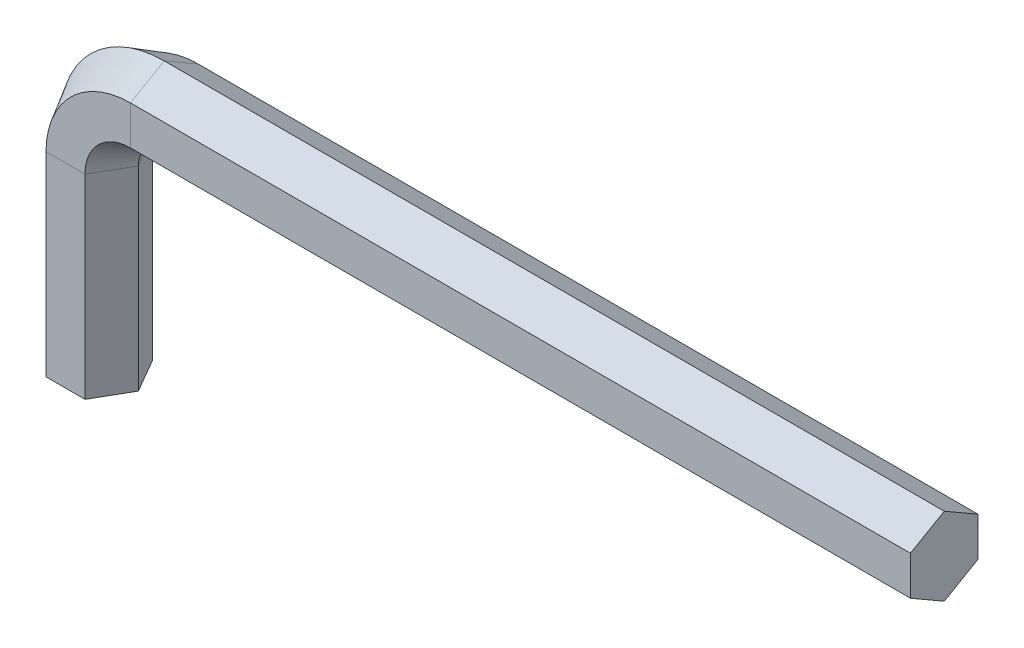
ISO-10303-21;
HEADER;
FILE_DESCRIPTION(('STEP AP214'),'2;1');
FILE_NAME('part.step','',(''),(''),'','','');
FILE_SCHEMA(('AUTOMOTIVE_DESIGN { 1 0 10303 214 1 1 1 1 }'));
ENDSEC;
DATA;
#1=APPLICATION_CONTEXT('core data for automotive mechanical design processes');
#2=APPLICATION_PROTOCOL_DEFINITION('international standard','automotive_design',2000,#1);
#3=PRODUCT_CONTEXT('',#1,'mechanical');
#4=PRODUCT('Part','Part','',(#3));
#5=PRODUCT_RELATED_PRODUCT_CATEGORY('part','',(#4));
#6=PRODUCT_DEFINITION_FORMATION('','',#4);
#7=PRODUCT_DEFINITION_CONTEXT('part definition',#1,'design');
#8=PRODUCT_DEFINITION('design','',#6,#7);
#9=PRODUCT_DEFINITION_SHAPE('','',#8);
#10=(LENGTH_UNIT() NAMED_UNIT(*) SI_UNIT(.MILLI.,.METRE.));
#11=(NAMED_UNIT(*) PLANE_ANGLE_UNIT() SI_UNIT($,.RADIAN.));
#12=(NAMED_UNIT(*) SI_UNIT($,.STERADIAN.) SOLID_ANGLE_UNIT());
#13=UNCERTAINTY_MEASURE_WITH_UNIT(LENGTH_MEASURE(1.E-05),#10,'distance_accuracy_value','');
#14=(GEOMETRIC_REPRESENTATION_CONTEXT(3) GLOBAL_UNCERTAINTY_ASSIGNED_CONTEXT((#13)) GLOBAL_UNIT_ASSIGNED_CONTEXT((#10,
#11,#12)) REPRESENTATION_CONTEXT('',''));
#15=CARTESIAN_POINT('',(0.,0.,0.));
#16=DIRECTION('',(0.,0.,1.));
#17=DIRECTION('',(1.,0.,0.));
#18=AXIS2_PLACEMENT_3D('',#15,#16,#17);
#19=CARTESIAN_POINT('',(0.,0.,0.));
#20=DIRECTION('',(0.,1.,0.));
#21=DIRECTION('',(0.,0.,1.));
#22=AXIS2_PLACEMENT_3D('',#19,#20,#21);
#23=PLANE('',#22);
#24=DIRECTION('',(1.,0.,0.));
#25=VECTOR('',#24,1.);
#26=CARTESIAN_POINT('',(-1.5,0.,2.59807621135332));
#27=LINE('',#26,#25);
#28=CARTESIAN_POINT('',(-1.5,0.,2.59807621135332));
#29=VERTEX_POINT('',#28);
#30=CARTESIAN_POINT('',(1.5,0.,2.59807621135332));
#31=VERTEX_POINT('',#30);
#32=EDGE_CURVE('E189',#29,#31,#27,.T.);
#33=ORIENTED_EDGE('',*,*,#32,.F.);
#34=DIRECTION('',(0.5,0.,0.866025403784439));
#35=VECTOR('',#34,1.);
#36=CARTESIAN_POINT('',(-3.,0.,0.));
#37=LINE('',#36,#35);
#38=CARTESIAN_POINT('',(-3.,0.,0.));
#39=VERTEX_POINT('',#38);
#40=EDGE_CURVE('E228',#39,#29,#37,.T.);
#41=ORIENTED_EDGE('',*,*,#40,.F.);
#42=DIRECTION('',(-0.5,0.,0.866025403784439));
#43=VECTOR('',#42,1.);
#44=CARTESIAN_POINT('',(-1.5,0.,-2.59807621135332));
#45=LINE('',#44,#43);
#46=CARTESIAN_POINT('',(-1.5,0.,-2.59807621135332));
#47=VERTEX_POINT('',#46);
#48=EDGE_CURVE('E220',#47,#39,#45,.T.);
#49=ORIENTED_EDGE('',*,*,#48,.F.);
#50=DIRECTION('',(-1.,0.,0.));
#51=VECTOR('',#50,1.);
#52=CARTESIAN_POINT('',(1.5,0.,-2.59807621135332));
#53=LINE('',#52,#51);
#54=CARTESIAN_POINT('',(1.5,0.,-2.59807621135332));
#55=VERTEX_POINT('',#54);
#56=EDGE_CURVE('E138',#55,#47,#53,.T.);
#57=ORIENTED_EDGE('',*,*,#56,.F.);
#58=DIRECTION('',(-0.5,0.,-0.866025403784439));
#59=VECTOR('',#58,1.);
#60=CARTESIAN_POINT('',(3.,0.,0.));
#61=LINE('',#60,#59);
#62=CARTESIAN_POINT('',(3.,0.,0.));
#63=VERTEX_POINT('',#62);
#64=EDGE_CURVE('E145',#63,#55,#61,.T.);
#65=ORIENTED_EDGE('',*,*,#64,.F.);
#66=DIRECTION('',(0.5,0.,-0.866025403784439));
#67=VECTOR('',#66,1.);
#68=CARTESIAN_POINT('',(1.5,0.,2.59807621135332));
#69=LINE('',#68,#67);
#70=EDGE_CURVE('E149',#31,#63,#69,.T.);
#71=ORIENTED_EDGE('',*,*,#70,.F.);
#72=EDGE_LOOP('',(#33,#41,#49,#57,#65,#71));
#73=FACE_BOUND('',#72,.T.);
#74=ADVANCED_FACE('F39',(#73),#23,.F.);
#75=CARTESIAN_POINT('',(65.,20.,0.));
#76=DIRECTION('',(1.,0.,0.));
#77=DIRECTION('',(0.,0.,1.));
#78=AXIS2_PLACEMENT_3D('',#75,#76,#77);
#79=PLANE('',#78);
#80=DIRECTION('',(0.,-1.,0.));
#81=VECTOR('',#80,1.);
#82=CARTESIAN_POINT('',(65.,21.5,2.59807621135332));
#83=LINE('',#82,#81);
#84=CARTESIAN_POINT('',(65.,21.5,2.59807621135332));
#85=VERTEX_POINT('',#84);
#86=CARTESIAN_POINT('',(65.,18.5,2.59807621135332));
#87=VERTEX_POINT('',#86);
#88=EDGE_CURVE('E159',#85,#87,#83,.T.);
#89=ORIENTED_EDGE('',*,*,#88,.T.);
#90=DIRECTION('',(0.,-0.5,-0.866025403784439));
#91=VECTOR('',#90,1.);
#92=CARTESIAN_POINT('',(65.,18.5,2.59807621135332));
#93=LINE('',#92,#91);
#94=CARTESIAN_POINT('',(65.,17.,0.));
#95=VERTEX_POINT('',#94);
#96=EDGE_CURVE('E162',#87,#95,#93,.T.);
#97=ORIENTED_EDGE('',*,*,#96,.T.);
#98=DIRECTION('',(0.,0.5,-0.866025403784439));
#99=VECTOR('',#98,1.);
#100=CARTESIAN_POINT('',(65.,17.,0.));
#101=LINE('',#100,#99);
#102=CARTESIAN_POINT('',(65.,18.5,-2.59807621135332));
#103=VERTEX_POINT('',#102);
#104=EDGE_CURVE('E201',#95,#103,#101,.T.);
#105=ORIENTED_EDGE('',*,*,#104,.T.);
#106=DIRECTION('',(0.,1.,0.));
#107=VECTOR('',#106,1.);
#108=CARTESIAN_POINT('',(65.,18.5,-2.59807621135332));
#109=LINE('',#108,#107);
#110=CARTESIAN_POINT('',(65.,21.5,-2.59807621135332));
#111=VERTEX_POINT('',#110);
#112=EDGE_CURVE('E59',#103,#111,#109,.T.);
#113=ORIENTED_EDGE('',*,*,#112,.T.);
#114=DIRECTION('',(0.,0.5,0.866025403784439));
#115=VECTOR('',#114,1.);
#116=CARTESIAN_POINT('',(65.,21.5,-2.59807621135332));
#117=LINE('',#116,#115);
#118=CARTESIAN_POINT('',(65.,23.,0.));
#119=VERTEX_POINT('',#118);
#120=EDGE_CURVE('E55',#111,#119,#117,.T.);
#121=ORIENTED_EDGE('',*,*,#120,.T.);
#122=DIRECTION('',(0.,-0.5,0.866025403784439));
#123=VECTOR('',#122,1.);
#124=CARTESIAN_POINT('',(65.,23.,0.));
#125=LINE('',#124,#123);
#126=EDGE_CURVE('E11',#119,#85,#125,.T.);
#127=ORIENTED_EDGE('',*,*,#126,.T.);
#128=EDGE_LOOP('',(#89,#97,#105,#113,#121,#127));
#129=FACE_BOUND('',#128,.T.);
#130=ADVANCED_FACE('F165',(#129),#79,.T.);
#131=CARTESIAN_POINT('',(-1.5,0.,2.59807621135332));
#132=DIRECTION('',(0.,0.,1.));
#133=DIRECTION('',(1.,0.,0.));
#134=AXIS2_PLACEMENT_3D('',#131,#132,#133);
#135=PLANE('',#134);
#136=DIRECTION('',(0.,1.,0.));
#137=VECTOR('',#136,1.);
#138=CARTESIAN_POINT('',(1.5,0.,2.59807621135332));
#139=LINE('',#138,#137);
#140=CARTESIAN_POINT('',(1.5,15.,2.59807621135332));
#141=VERTEX_POINT('',#140);
#142=EDGE_CURVE('E194',#31,#141,#139,.T.);
#143=ORIENTED_EDGE('',*,*,#142,.T.);
#144=DIRECTION('',(1.,0.,0.));
#145=VECTOR('',#144,1.);
#146=CARTESIAN_POINT('',(-1.5,15.,2.59807621135332));
#147=LINE('',#146,#145);
#148=CARTESIAN_POINT('',(-1.5,15.,2.59807621135332));
#149=VERTEX_POINT('',#148);
#150=EDGE_CURVE('E265',#149,#141,#147,.T.);
#151=ORIENTED_EDGE('',*,*,#150,.F.);
#152=DIRECTION('',(0.,1.,0.));
#153=VECTOR('',#152,1.);
#154=CARTESIAN_POINT('',(-1.5,0.,2.59807621135332));
#155=LINE('',#154,#153);
#156=EDGE_CURVE('E241',#29,#149,#155,.T.);
#157=ORIENTED_EDGE('',*,*,#156,.F.);
#158=ORIENTED_EDGE('',*,*,#32,.T.);
#159=EDGE_LOOP('',(#143,#151,#157,#158));
#160=FACE_BOUND('',#159,.T.);
#161=ADVANCED_FACE('F267',(#160),#135,.T.);
#162=CARTESIAN_POINT('',(1.5,0.,2.59807621135332));
#163=DIRECTION('',(0.866025403784439,0.,0.5));
#164=DIRECTION('',(0.5,0.,-0.866025403784439));
#165=AXIS2_PLACEMENT_3D('',#162,#163,#164);
#166=PLANE('',#165);
#167=DIRECTION('',(0.,1.,0.));
#168=VECTOR('',#167,1.);
#169=CARTESIAN_POINT('',(3.,0.,0.));
#170=LINE('',#169,#168);
#171=CARTESIAN_POINT('',(3.,15.,0.));
#172=VERTEX_POINT('',#171);
#173=EDGE_CURVE('E195',#63,#172,#170,.T.);
#174=ORIENTED_EDGE('',*,*,#173,.T.);
#175=DIRECTION('',(0.5,0.,-0.866025403784439));
#176=VECTOR('',#175,1.);
#177=CARTESIAN_POINT('',(1.5,15.,2.59807621135332));
#178=LINE('',#177,#176);
#179=EDGE_CURVE('E186',#141,#172,#178,.T.);
#180=ORIENTED_EDGE('',*,*,#179,.F.);
#181=ORIENTED_EDGE('',*,*,#142,.F.);
#182=ORIENTED_EDGE('',*,*,#70,.T.);
#183=EDGE_LOOP('',(#174,#180,#181,#182));
#184=FACE_BOUND('',#183,.T.);
#185=ADVANCED_FACE('F275',(#184),#166,.T.);
#186=CARTESIAN_POINT('',(3.,0.,0.));
#187=DIRECTION('',(0.866025403784439,0.,-0.5));
#188=DIRECTION('',(-0.5,0.,-0.866025403784439));
#189=AXIS2_PLACEMENT_3D('',#186,#187,#188);
#190=PLANE('',#189);
#191=DIRECTION('',(0.,1.,0.));
#192=VECTOR('',#191,1.);
#193=CARTESIAN_POINT('',(1.5,0.,-2.59807621135332));
#194=LINE('',#193,#192);
#195=CARTESIAN_POINT('',(1.5,15.,-2.59807621135332));
#196=VERTEX_POINT('',#195);
#197=EDGE_CURVE('E206',#55,#196,#194,.T.);
#198=ORIENTED_EDGE('',*,*,#197,.T.);
#199=DIRECTION('',(-0.5,0.,-0.866025403784439));
#200=VECTOR('',#199,1.);
#201=CARTESIAN_POINT('',(3.,15.,0.));
#202=LINE('',#201,#200);
#203=EDGE_CURVE('E198',#172,#196,#202,.T.);
#204=ORIENTED_EDGE('',*,*,#203,.F.);
#205=ORIENTED_EDGE('',*,*,#173,.F.);
#206=ORIENTED_EDGE('',*,*,#64,.T.);
#207=EDGE_LOOP('',(#198,#204,#205,#206));
#208=FACE_BOUND('',#207,.T.);
#209=ADVANCED_FACE('F330',(#208),#190,.T.);
#210=CARTESIAN_POINT('',(1.5,0.,-2.59807621135332));
#211=DIRECTION('',(0.,0.,-1.));
#212=DIRECTION('',(-1.,0.,0.));
#213=AXIS2_PLACEMENT_3D('',#210,#211,#212);
#214=PLANE('',#213);
#215=DIRECTION('',(0.,1.,0.));
#216=VECTOR('',#215,1.);
#217=CARTESIAN_POINT('',(-1.5,0.,-2.59807621135332));
#218=LINE('',#217,#216);
#219=CARTESIAN_POINT('',(-1.5,15.,-2.59807621135332));
#220=VERTEX_POINT('',#219);
#221=EDGE_CURVE('E218',#47,#220,#218,.T.);
#222=ORIENTED_EDGE('',*,*,#221,.T.);
#223=DIRECTION('',(-1.,0.,0.));
#224=VECTOR('',#223,1.);
#225=CARTESIAN_POINT('',(1.5,15.,-2.59807621135332));
#226=LINE('',#225,#224);
#227=EDGE_CURVE('E207',#196,#220,#226,.T.);
#228=ORIENTED_EDGE('',*,*,#227,.F.);
#229=ORIENTED_EDGE('',*,*,#197,.F.);
#230=ORIENTED_EDGE('',*,*,#56,.T.);
#231=EDGE_LOOP('',(#222,#228,#229,#230));
#232=FACE_BOUND('',#231,.T.);
#233=ADVANCED_FACE('F333',(#232),#214,.T.);
#234=CARTESIAN_POINT('',(-1.5,0.,-2.59807621135332));
#235=DIRECTION('',(-0.866025403784439,0.,-0.5));
#236=DIRECTION('',(-0.5,0.,0.866025403784439));
#237=AXIS2_PLACEMENT_3D('',#234,#235,#236);
#238=PLANE('',#237);
#239=DIRECTION('',(0.,1.,0.));
#240=VECTOR('',#239,1.);
#241=CARTESIAN_POINT('',(-3.,0.,0.));
#242=LINE('',#241,#240);
#243=CARTESIAN_POINT('',(-3.,15.,0.));
#244=VERTEX_POINT('',#243);
#245=EDGE_CURVE('E235',#39,#244,#242,.T.);
#246=ORIENTED_EDGE('',*,*,#245,.T.);
#247=DIRECTION('',(-0.5,0.,0.866025403784439));
#248=VECTOR('',#247,1.);
#249=CARTESIAN_POINT('',(-1.5,15.,-2.59807621135332));
#250=LINE('',#249,#248);
#251=EDGE_CURVE('E225',#220,#244,#250,.T.);
#252=ORIENTED_EDGE('',*,*,#251,.F.);
#253=ORIENTED_EDGE('',*,*,#221,.F.);
#254=ORIENTED_EDGE('',*,*,#48,.T.);
#255=EDGE_LOOP('',(#246,#252,#253,#254));
#256=FACE_BOUND('',#255,.T.);
#257=ADVANCED_FACE('F343',(#256),#238,.T.);
#258=CARTESIAN_POINT('',(-3.,0.,0.));
#259=DIRECTION('',(-0.866025403784439,0.,0.5));
#260=DIRECTION('',(0.5,0.,0.866025403784439));
#261=AXIS2_PLACEMENT_3D('',#258,#259,#260);
#262=PLANE('',#261);
#263=DIRECTION('',(0.5,0.,0.866025403784439));
#264=VECTOR('',#263,1.);
#265=CARTESIAN_POINT('',(-3.,15.,0.));
#266=LINE('',#265,#264);
#267=EDGE_CURVE('E233',#244,#149,#266,.T.);
#268=ORIENTED_EDGE('',*,*,#267,.F.);
#269=ORIENTED_EDGE('',*,*,#245,.F.);
#270=ORIENTED_EDGE('',*,*,#40,.T.);
#271=ORIENTED_EDGE('',*,*,#156,.T.);
#272=EDGE_LOOP('',(#268,#269,#270,#271));
#273=FACE_BOUND('',#272,.T.);
#274=ADVANCED_FACE('F283',(#273),#262,.T.);
#275=CARTESIAN_POINT('',(-1.5,15.,2.59807621135332));
#276=DIRECTION('',(0.,0.,1.));
#277=DIRECTION('',(1.,0.,0.));
#278=AXIS2_PLACEMENT_3D('',#275,#276,#277);
#279=PLANE('',#278);
#280=CARTESIAN_POINT('',(5.,15.,2.59807621135332));
#281=DIRECTION('',(0.,0.,-1.));
#282=DIRECTION('',(-1.,0.,0.));
#283=AXIS2_PLACEMENT_3D('',#280,#281,#282);
#284=CIRCLE('',#283,3.5);
#285=CARTESIAN_POINT('',(5.00000000000002,18.5,2.59807621135332));
#286=VERTEX_POINT('',#285);
#287=EDGE_CURVE('E200',#141,#286,#284,.T.);
#288=ORIENTED_EDGE('',*,*,#287,.T.);
#289=DIRECTION('',(0.,-1.,0.));
#290=VECTOR('',#289,1.);
#291=CARTESIAN_POINT('',(5.00000000000004,21.5,2.59807621135332));
#292=LINE('',#291,#290);
#293=CARTESIAN_POINT('',(5.00000000000004,21.5,2.59807621135332));
#294=VERTEX_POINT('',#293);
#295=EDGE_CURVE('E182',#294,#286,#292,.T.);
#296=ORIENTED_EDGE('',*,*,#295,.F.);
#297=CARTESIAN_POINT('',(5.,15.,2.59807621135332));
#298=DIRECTION('',(0.,0.,-1.));
#299=DIRECTION('',(-1.,0.,0.));
#300=AXIS2_PLACEMENT_3D('',#297,#298,#299);
#301=CIRCLE('',#300,6.5);
#302=EDGE_CURVE('E247',#149,#294,#301,.T.);
#303=ORIENTED_EDGE('',*,*,#302,.F.);
#304=ORIENTED_EDGE('',*,*,#150,.T.);
#305=EDGE_LOOP('',(#288,#296,#303,#304));
#306=FACE_BOUND('',#305,.T.);
#307=ADVANCED_FACE('F252',(#306),#279,.T.);
#308=CARTESIAN_POINT('',(5.,15.,2.59807621135332));
#309=DIRECTION('',(0.,0.,1.));
#310=DIRECTION('',(1.,0.,0.));
#311=AXIS2_PLACEMENT_3D('',#308,#309,#310);
#312=CONICAL_SURFACE('',#311,3.5,0.523598775598299);
#313=CARTESIAN_POINT('',(5.,15.,0.));
#314=DIRECTION('',(0.,0.,-1.));
#315=DIRECTION('',(-1.,0.,0.));
#316=AXIS2_PLACEMENT_3D('',#313,#314,#315);
#317=CIRCLE('',#316,2.);
#318=CARTESIAN_POINT('',(5.00000000000001,17.,0.));
#319=VERTEX_POINT('',#318);
#320=EDGE_CURVE('E130',#172,#319,#317,.T.);
#321=ORIENTED_EDGE('',*,*,#320,.T.);
#322=DIRECTION('',(0.,-0.5,-0.866025403784439));
#323=VECTOR('',#322,1.);
#324=CARTESIAN_POINT('',(5.00000000000002,18.5,2.59807621135332));
#325=LINE('',#324,#323);
#326=EDGE_CURVE('E197',#286,#319,#325,.T.);
#327=ORIENTED_EDGE('',*,*,#326,.F.);
#328=ORIENTED_EDGE('',*,*,#287,.F.);
#329=ORIENTED_EDGE('',*,*,#179,.T.);
#330=EDGE_LOOP('',(#321,#327,#328,#329));
#331=FACE_BOUND('',#330,.T.);
#332=ADVANCED_FACE('F274',(#331),#312,.F.);
#333=CARTESIAN_POINT('',(5.,15.,0.));
#334=DIRECTION('',(0.,0.,-1.));
#335=DIRECTION('',(-1.,0.,0.));
#336=AXIS2_PLACEMENT_3D('',#333,#334,#335);
#337=CONICAL_SURFACE('',#336,2.,0.523598775598299);
#338=CARTESIAN_POINT('',(5.,15.,-2.59807621135332));
#339=DIRECTION('',(0.,0.,-1.));
#340=DIRECTION('',(-1.,0.,0.));
#341=AXIS2_PLACEMENT_3D('',#338,#339,#340);
#342=CIRCLE('',#341,3.5);
#343=CARTESIAN_POINT('',(5.00000000000002,18.5,-2.59807621135332));
#344=VERTEX_POINT('',#343);
#345=EDGE_CURVE('E119',#196,#344,#342,.T.);
#346=ORIENTED_EDGE('',*,*,#345,.T.);
#347=DIRECTION('',(0.,0.5,-0.866025403784439));
#348=VECTOR('',#347,1.);
#349=CARTESIAN_POINT('',(5.00000000000001,17.,0.));
#350=LINE('',#349,#348);
#351=EDGE_CURVE('E199',#319,#344,#350,.T.);
#352=ORIENTED_EDGE('',*,*,#351,.F.);
#353=ORIENTED_EDGE('',*,*,#320,.F.);
#354=ORIENTED_EDGE('',*,*,#203,.T.);
#355=EDGE_LOOP('',(#346,#352,#353,#354));
#356=FACE_BOUND('',#355,.T.);
#357=ADVANCED_FACE('F280',(#356),#337,.F.);
#358=CARTESIAN_POINT('',(1.5,15.,-2.59807621135332));
#359=DIRECTION('',(0.,0.,-1.));
#360=DIRECTION('',(-1.,0.,0.));
#361=AXIS2_PLACEMENT_3D('',#358,#359,#360);
#362=PLANE('',#361);
#363=CARTESIAN_POINT('',(5.,15.,-2.59807621135332));
#364=DIRECTION('',(0.,0.,-1.));
#365=DIRECTION('',(-1.,0.,0.));
#366=AXIS2_PLACEMENT_3D('',#363,#364,#365);
#367=CIRCLE('',#366,6.5);
#368=CARTESIAN_POINT('',(5.00000000000004,21.5,-2.59807621135332));
#369=VERTEX_POINT('',#368);
#370=EDGE_CURVE('E112',#220,#369,#367,.T.);
#371=ORIENTED_EDGE('',*,*,#370,.T.);
#372=DIRECTION('',(0.,1.,0.));
#373=VECTOR('',#372,1.);
#374=CARTESIAN_POINT('',(5.00000000000002,18.5,-2.59807621135332));
#375=LINE('',#374,#373);
#376=EDGE_CURVE('E213',#344,#369,#375,.T.);
#377=ORIENTED_EDGE('',*,*,#376,.F.);
#378=ORIENTED_EDGE('',*,*,#345,.F.);
#379=ORIENTED_EDGE('',*,*,#227,.T.);
#380=EDGE_LOOP('',(#371,#377,#378,#379));
#381=FACE_BOUND('',#380,.T.);
#382=ADVANCED_FACE('F284',(#381),#362,.T.);
#383=CARTESIAN_POINT('',(5.,15.,-2.59807621135332));
#384=DIRECTION('',(0.,0.,1.));
#385=DIRECTION('',(1.,0.,0.));
#386=AXIS2_PLACEMENT_3D('',#383,#384,#385);
#387=CONICAL_SURFACE('',#386,6.5,0.523598775598299);
#388=CARTESIAN_POINT('',(5.,15.,0.));
#389=DIRECTION('',(0.,0.,-1.));
#390=DIRECTION('',(-1.,0.,0.));
#391=AXIS2_PLACEMENT_3D('',#388,#389,#390);
#392=CIRCLE('',#391,8.);
#393=CARTESIAN_POINT('',(5.00000000000006,23.,0.));
#394=VERTEX_POINT('',#393);
#395=EDGE_CURVE('E240',#244,#394,#392,.T.);
#396=ORIENTED_EDGE('',*,*,#395,.T.);
#397=DIRECTION('',(0.,0.5,0.866025403784439));
#398=VECTOR('',#397,1.);
#399=CARTESIAN_POINT('',(5.00000000000004,21.5,-2.59807621135332));
#400=LINE('',#399,#398);
#401=EDGE_CURVE('E223',#369,#394,#400,.T.);
#402=ORIENTED_EDGE('',*,*,#401,.F.);
#403=ORIENTED_EDGE('',*,*,#370,.F.);
#404=ORIENTED_EDGE('',*,*,#251,.T.);
#405=EDGE_LOOP('',(#396,#402,#403,#404));
#406=FACE_BOUND('',#405,.T.);
#407=ADVANCED_FACE('F389',(#406),#387,.T.);
#408=CARTESIAN_POINT('',(5.,15.,0.));
#409=DIRECTION('',(0.,0.,-1.));
#410=DIRECTION('',(-1.,0.,0.));
#411=AXIS2_PLACEMENT_3D('',#408,#409,#410);
#412=CONICAL_SURFACE('',#411,8.,0.523598775598299);
#413=DIRECTION('',(0.,-0.5,0.866025403784439));
#414=VECTOR('',#413,1.);
#415=CARTESIAN_POINT('',(5.00000000000006,23.,0.));
#416=LINE('',#415,#414);
#417=EDGE_CURVE('E187',#394,#294,#416,.T.);
#418=ORIENTED_EDGE('',*,*,#417,.F.);
#419=ORIENTED_EDGE('',*,*,#395,.F.);
#420=ORIENTED_EDGE('',*,*,#267,.T.);
#421=ORIENTED_EDGE('',*,*,#302,.T.);
#422=EDGE_LOOP('',(#418,#419,#420,#421));
#423=FACE_BOUND('',#422,.T.);
#424=ADVANCED_FACE('F254',(#423),#412,.T.);
#425=CARTESIAN_POINT('',(5.00000000000004,21.5,2.59807621135332));
#426=DIRECTION('',(0.,0.,1.));
#427=DIRECTION('',(1.,0.,0.));
#428=AXIS2_PLACEMENT_3D('',#425,#426,#427);
#429=PLANE('',#428);
#430=DIRECTION('',(1.,0.,0.));
#431=VECTOR('',#430,1.);
#432=CARTESIAN_POINT('',(5.00000000000004,18.5,2.59807621135332));
#433=LINE('',#432,#431);
#434=EDGE_CURVE('E169',#286,#87,#433,.T.);
#435=ORIENTED_EDGE('',*,*,#434,.T.);
#436=ORIENTED_EDGE('',*,*,#88,.F.);
#437=DIRECTION('',(1.,0.,0.));
#438=VECTOR('',#437,1.);
#439=CARTESIAN_POINT('',(5.00000000000004,21.5,2.59807621135332));
#440=LINE('',#439,#438);
#441=EDGE_CURVE('E166',#294,#85,#440,.T.);
#442=ORIENTED_EDGE('',*,*,#441,.F.);
#443=ORIENTED_EDGE('',*,*,#295,.T.);
#444=EDGE_LOOP('',(#435,#436,#442,#443));
#445=FACE_BOUND('',#444,.T.);
#446=ADVANCED_FACE('F176',(#445),#429,.T.);
#447=CARTESIAN_POINT('',(5.00000000000004,18.5,2.59807621135332));
#448=DIRECTION('',(0.,-0.866025403784439,0.5));
#449=DIRECTION('',(0.,-0.5,-0.866025403784439));
#450=AXIS2_PLACEMENT_3D('',#447,#448,#449);
#451=PLANE('',#450);
#452=DIRECTION('',(1.,0.,0.));
#453=VECTOR('',#452,1.);
#454=CARTESIAN_POINT('',(5.00000000000004,17.,0.));
#455=LINE('',#454,#453);
#456=EDGE_CURVE('E177',#319,#95,#455,.T.);
#457=ORIENTED_EDGE('',*,*,#456,.T.);
#458=ORIENTED_EDGE('',*,*,#96,.F.);
#459=ORIENTED_EDGE('',*,*,#434,.F.);
#460=ORIENTED_EDGE('',*,*,#326,.T.);
#461=EDGE_LOOP('',(#457,#458,#459,#460));
#462=FACE_BOUND('',#461,.T.);
#463=ADVANCED_FACE('F174',(#462),#451,.T.);
#464=CARTESIAN_POINT('',(5.00000000000004,17.,0.));
#465=DIRECTION('',(0.,-0.866025403784439,-0.5));
#466=DIRECTION('',(0.,0.5,-0.866025403784439));
#467=AXIS2_PLACEMENT_3D('',#464,#465,#466);
#468=PLANE('',#467);
#469=DIRECTION('',(1.,0.,0.));
#470=VECTOR('',#469,1.);
#471=CARTESIAN_POINT('',(5.00000000000004,18.5,-2.59807621135332));
#472=LINE('',#471,#470);
#473=EDGE_CURVE('E96',#344,#103,#472,.T.);
#474=ORIENTED_EDGE('',*,*,#473,.T.);
#475=ORIENTED_EDGE('',*,*,#104,.F.);
#476=ORIENTED_EDGE('',*,*,#456,.F.);
#477=ORIENTED_EDGE('',*,*,#351,.T.);
#478=EDGE_LOOP('',(#474,#475,#476,#477));
#479=FACE_BOUND('',#478,.T.);
#480=ADVANCED_FACE('F419',(#479),#468,.T.);
#481=CARTESIAN_POINT('',(5.00000000000004,18.5,-2.59807621135332));
#482=DIRECTION('',(0.,0.,-1.));
#483=DIRECTION('',(-1.,0.,0.));
#484=AXIS2_PLACEMENT_3D('',#481,#482,#483);
#485=PLANE('',#484);
#486=DIRECTION('',(1.,0.,0.));
#487=VECTOR('',#486,1.);
#488=CARTESIAN_POINT('',(5.00000000000004,21.5,-2.59807621135332));
#489=LINE('',#488,#487);
#490=EDGE_CURVE('E86',#369,#111,#489,.T.);
#491=ORIENTED_EDGE('',*,*,#490,.T.);
#492=ORIENTED_EDGE('',*,*,#112,.F.);
#493=ORIENTED_EDGE('',*,*,#473,.F.);
#494=ORIENTED_EDGE('',*,*,#376,.T.);
#495=EDGE_LOOP('',(#491,#492,#493,#494));
#496=FACE_BOUND('',#495,.T.);
#497=ADVANCED_FACE('F293',(#496),#485,.T.);
#498=CARTESIAN_POINT('',(5.00000000000004,21.5,-2.59807621135332));
#499=DIRECTION('',(0.,0.866025403784439,-0.5));
#500=DIRECTION('',(0.,0.5,0.866025403784439));
#501=AXIS2_PLACEMENT_3D('',#498,#499,#500);
#502=PLANE('',#501);
#503=DIRECTION('',(1.,0.,0.));
#504=VECTOR('',#503,1.);
#505=CARTESIAN_POINT('',(5.00000000000004,23.,0.));
#506=LINE('',#505,#504);
#507=EDGE_CURVE('E46',#394,#119,#506,.T.);
#508=ORIENTED_EDGE('',*,*,#507,.T.);
#509=ORIENTED_EDGE('',*,*,#120,.F.);
#510=ORIENTED_EDGE('',*,*,#490,.F.);
#511=ORIENTED_EDGE('',*,*,#401,.T.);
#512=EDGE_LOOP('',(#508,#509,#510,#511));
#513=FACE_BOUND('',#512,.T.);
#514=ADVANCED_FACE('F288',(#513),#502,.T.);
#515=CARTESIAN_POINT('',(5.00000000000004,23.,0.));
#516=DIRECTION('',(0.,0.866025403784439,0.5));
#517=DIRECTION('',(0.,-0.5,0.866025403784439));
#518=AXIS2_PLACEMENT_3D('',#515,#516,#517);
#519=PLANE('',#518);
#520=ORIENTED_EDGE('',*,*,#126,.F.);
#521=ORIENTED_EDGE('',*,*,#507,.F.);
#522=ORIENTED_EDGE('',*,*,#417,.T.);
#523=ORIENTED_EDGE('',*,*,#441,.T.);
#524=EDGE_LOOP('',(#520,#521,#522,#523));
#525=FACE_BOUND('',#524,.T.);
#526=ADVANCED_FACE('F250',(#525),#519,.T.);
#527=CLOSED_SHELL('',(#74,#130,#161,#185,#209,#233,#257,#274,#307,#332,#357,#382,#407,#424,#446,
#463,#480,#497,#514,#526));
#528=MANIFOLD_SOLID_BREP('B2',#527);
#529=ADVANCED_BREP_SHAPE_REPRESENTATION('',(#18,#528),#14);
#530=SHAPE_DEFINITION_REPRESENTATION(#9,#529);
ENDSEC;
END-ISO-10303-21;
